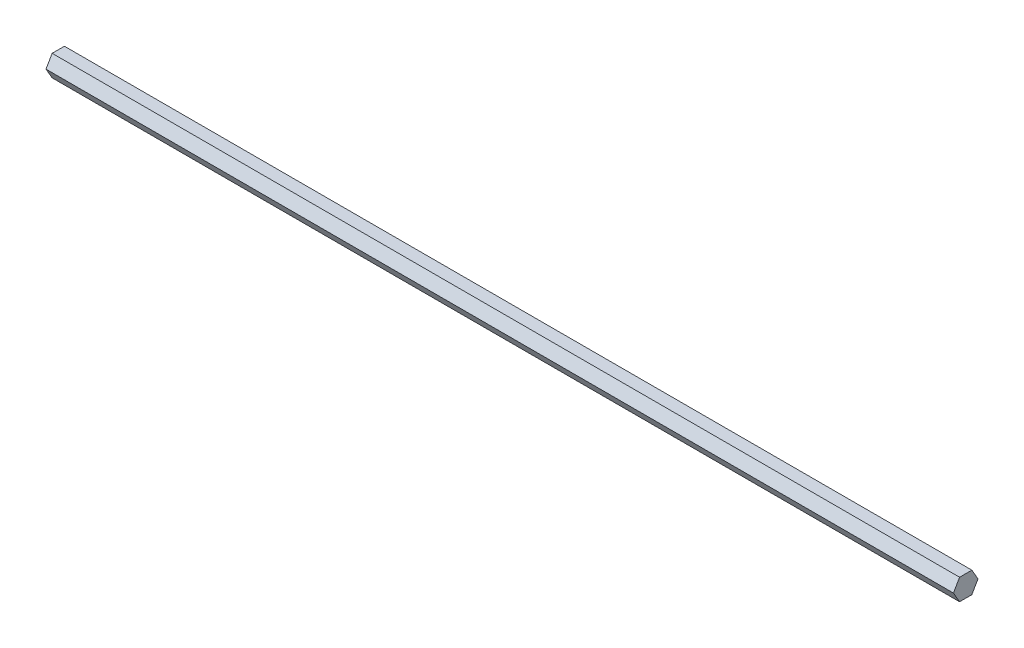
ISO-10303-21;
HEADER;
FILE_DESCRIPTION(('STEP AP214'),'2;1');
FILE_NAME('part.step','',(''),(''),'','','');
FILE_SCHEMA(('AUTOMOTIVE_DESIGN { 1 0 10303 214 1 1 1 1 }'));
ENDSEC;
DATA;
#1=APPLICATION_CONTEXT('core data for automotive mechanical design processes');
#2=APPLICATION_PROTOCOL_DEFINITION('international standard','automotive_design',2000,#1);
#3=PRODUCT_CONTEXT('',#1,'mechanical');
#4=PRODUCT('Part','Part','',(#3));
#5=PRODUCT_RELATED_PRODUCT_CATEGORY('part','',(#4));
#6=PRODUCT_DEFINITION_FORMATION('','',#4);
#7=PRODUCT_DEFINITION_CONTEXT('part definition',#1,'design');
#8=PRODUCT_DEFINITION('design','',#6,#7);
#9=PRODUCT_DEFINITION_SHAPE('','',#8);
#10=(LENGTH_UNIT() NAMED_UNIT(*) SI_UNIT(.MILLI.,.METRE.));
#11=(NAMED_UNIT(*) PLANE_ANGLE_UNIT() SI_UNIT($,.RADIAN.));
#12=(NAMED_UNIT(*) SI_UNIT($,.STERADIAN.) SOLID_ANGLE_UNIT());
#13=UNCERTAINTY_MEASURE_WITH_UNIT(LENGTH_MEASURE(1.E-05),#10,'distance_accuracy_value','');
#14=(GEOMETRIC_REPRESENTATION_CONTEXT(3) GLOBAL_UNCERTAINTY_ASSIGNED_CONTEXT((#13)) GLOBAL_UNIT_ASSIGNED_CONTEXT((#10,
#11,#12)) REPRESENTATION_CONTEXT('',''));
#15=CARTESIAN_POINT('',(0.,0.,0.));
#16=DIRECTION('',(0.,0.,1.));
#17=DIRECTION('',(1.,0.,0.));
#18=AXIS2_PLACEMENT_3D('',#15,#16,#17);
#19=CARTESIAN_POINT('',(203.2,-4.76249999999997,-2.74963065701565));
#20=DIRECTION('',(0.,0.499999999999995,0.866025403784441));
#21=DIRECTION('',(0.,-0.866025403784441,0.499999999999995));
#22=AXIS2_PLACEMENT_3D('',#19,#20,#21);
#23=PLANE('',#22);
#24=DIRECTION('',(0.,0.866025403784441,-0.499999999999995));
#25=VECTOR('',#24,1.);
#26=CARTESIAN_POINT('',(-203.2,-4.76249999999997,-2.74963065701565));
#27=LINE('',#26,#25);
#28=CARTESIAN_POINT('',(-203.2,-4.76249999999997,-2.74963065701565));
#29=VERTEX_POINT('',#28);
#30=CARTESIAN_POINT('',(-203.2,0.,-5.49926131403119));
#31=VERTEX_POINT('',#30);
#32=EDGE_CURVE('E132',#29,#31,#27,.T.);
#33=ORIENTED_EDGE('',*,*,#32,.T.);
#34=DIRECTION('',(-1.,0.,0.));
#35=VECTOR('',#34,1.);
#36=CARTESIAN_POINT('',(203.2,0.,-5.49926131403119));
#37=LINE('',#36,#35);
#38=CARTESIAN_POINT('',(203.2,0.,-5.49926131403119));
#39=VERTEX_POINT('',#38);
#40=EDGE_CURVE('E11',#39,#31,#37,.T.);
#41=ORIENTED_EDGE('',*,*,#40,.F.);
#42=DIRECTION('',(0.,0.866025403784441,-0.499999999999995));
#43=VECTOR('',#42,1.);
#44=CARTESIAN_POINT('',(203.2,-4.76249999999997,-2.74963065701565));
#45=LINE('',#44,#43);
#46=CARTESIAN_POINT('',(203.2,-4.76249999999997,-2.74963065701565));
#47=VERTEX_POINT('',#46);
#48=EDGE_CURVE('E143',#47,#39,#45,.T.);
#49=ORIENTED_EDGE('',*,*,#48,.F.);
#50=DIRECTION('',(-1.,0.,0.));
#51=VECTOR('',#50,1.);
#52=CARTESIAN_POINT('',(203.2,-4.76249999999997,-2.74963065701565));
#53=LINE('',#52,#51);
#54=EDGE_CURVE('E128',#47,#29,#53,.T.);
#55=ORIENTED_EDGE('',*,*,#54,.T.);
#56=EDGE_LOOP('',(#33,#41,#49,#55));
#57=FACE_BOUND('',#56,.T.);
#58=ADVANCED_FACE('F46',(#57),#23,.F.);
#59=CARTESIAN_POINT('',(203.2,0.,-5.49926131403119));
#60=DIRECTION('',(0.,-0.500000000000001,0.866025403784438));
#61=DIRECTION('',(0.,-0.866025403784438,-0.500000000000001));
#62=AXIS2_PLACEMENT_3D('',#59,#60,#61);
#63=PLANE('',#62);
#64=DIRECTION('',(0.,0.866025403784438,0.500000000000001));
#65=VECTOR('',#64,1.);
#66=CARTESIAN_POINT('',(-203.2,0.,-5.49926131403119));
#67=LINE('',#66,#65);
#68=CARTESIAN_POINT('',(-203.2,4.76250000000001,-2.74963065701558));
#69=VERTEX_POINT('',#68);
#70=EDGE_CURVE('E135',#31,#69,#67,.T.);
#71=ORIENTED_EDGE('',*,*,#70,.T.);
#72=DIRECTION('',(-1.,0.,0.));
#73=VECTOR('',#72,1.);
#74=CARTESIAN_POINT('',(203.2,4.76250000000001,-2.74963065701558));
#75=LINE('',#74,#73);
#76=CARTESIAN_POINT('',(203.2,4.76250000000001,-2.74963065701558));
#77=VERTEX_POINT('',#76);
#78=EDGE_CURVE('E54',#77,#69,#75,.T.);
#79=ORIENTED_EDGE('',*,*,#78,.F.);
#80=DIRECTION('',(0.,0.866025403784438,0.500000000000001));
#81=VECTOR('',#80,1.);
#82=CARTESIAN_POINT('',(203.2,0.,-5.49926131403119));
#83=LINE('',#82,#81);
#84=EDGE_CURVE('E100',#39,#77,#83,.T.);
#85=ORIENTED_EDGE('',*,*,#84,.F.);
#86=ORIENTED_EDGE('',*,*,#40,.T.);
#87=EDGE_LOOP('',(#71,#79,#85,#86));
#88=FACE_BOUND('',#87,.T.);
#89=ADVANCED_FACE('F167',(#88),#63,.F.);
#90=CARTESIAN_POINT('',(203.2,4.76250000000001,-2.74963065701558));
#91=DIRECTION('',(0.,-1.,0.));
#92=DIRECTION('',(0.,0.,-1.));
#93=AXIS2_PLACEMENT_3D('',#90,#91,#92);
#94=PLANE('',#93);
#95=DIRECTION('',(0.,0.,1.));
#96=VECTOR('',#95,1.);
#97=CARTESIAN_POINT('',(-203.2,4.76250000000001,-2.74963065701558));
#98=LINE('',#97,#96);
#99=CARTESIAN_POINT('',(-203.2,4.76249999999999,2.74963065701562));
#100=VERTEX_POINT('',#99);
#101=EDGE_CURVE('E138',#69,#100,#98,.T.);
#102=ORIENTED_EDGE('',*,*,#101,.T.);
#103=DIRECTION('',(-1.,0.,0.));
#104=VECTOR('',#103,1.);
#105=CARTESIAN_POINT('',(203.2,4.76249999999999,2.74963065701562));
#106=LINE('',#105,#104);
#107=CARTESIAN_POINT('',(203.2,4.76249999999999,2.74963065701562));
#108=VERTEX_POINT('',#107);
#109=EDGE_CURVE('E123',#108,#100,#106,.T.);
#110=ORIENTED_EDGE('',*,*,#109,.F.);
#111=DIRECTION('',(0.,0.,1.));
#112=VECTOR('',#111,1.);
#113=CARTESIAN_POINT('',(203.2,4.76250000000001,-2.74963065701558));
#114=LINE('',#113,#112);
#115=EDGE_CURVE('E114',#77,#108,#114,.T.);
#116=ORIENTED_EDGE('',*,*,#115,.F.);
#117=ORIENTED_EDGE('',*,*,#78,.T.);
#118=EDGE_LOOP('',(#102,#110,#116,#117));
#119=FACE_BOUND('',#118,.T.);
#120=ADVANCED_FACE('F149',(#119),#94,.F.);
#121=CARTESIAN_POINT('',(203.2,4.76249999999999,2.74963065701562));
#122=DIRECTION('',(0.,-0.499999999999995,-0.866025403784441));
#123=DIRECTION('',(0.,0.866025403784442,-0.499999999999995));
#124=AXIS2_PLACEMENT_3D('',#121,#122,#123);
#125=PLANE('',#124);
#126=DIRECTION('',(0.,-0.866025403784442,0.499999999999995));
#127=VECTOR('',#126,1.);
#128=CARTESIAN_POINT('',(-203.2,4.76249999999999,2.74963065701562));
#129=LINE('',#128,#127);
#130=CARTESIAN_POINT('',(-203.2,0.,5.49926131403119));
#131=VERTEX_POINT('',#130);
#132=EDGE_CURVE('E122',#100,#131,#129,.T.);
#133=ORIENTED_EDGE('',*,*,#132,.T.);
#134=DIRECTION('',(-1.,0.,0.));
#135=VECTOR('',#134,1.);
#136=CARTESIAN_POINT('',(203.2,0.,5.49926131403119));
#137=LINE('',#136,#135);
#138=CARTESIAN_POINT('',(203.2,0.,5.49926131403119));
#139=VERTEX_POINT('',#138);
#140=EDGE_CURVE('E119',#139,#131,#137,.T.);
#141=ORIENTED_EDGE('',*,*,#140,.F.);
#142=DIRECTION('',(0.,-0.866025403784442,0.499999999999995));
#143=VECTOR('',#142,1.);
#144=CARTESIAN_POINT('',(203.2,4.76249999999999,2.74963065701562));
#145=LINE('',#144,#143);
#146=EDGE_CURVE('E108',#108,#139,#145,.T.);
#147=ORIENTED_EDGE('',*,*,#146,.F.);
#148=ORIENTED_EDGE('',*,*,#109,.T.);
#149=EDGE_LOOP('',(#133,#141,#147,#148));
#150=FACE_BOUND('',#149,.T.);
#151=ADVANCED_FACE('F120',(#150),#125,.F.);
#152=CARTESIAN_POINT('',(203.2,0.,5.49926131403119));
#153=DIRECTION('',(0.,0.500000000000007,-0.866025403784435));
#154=DIRECTION('',(0.,0.866025403784435,0.500000000000007));
#155=AXIS2_PLACEMENT_3D('',#152,#153,#154);
#156=PLANE('',#155);
#157=DIRECTION('',(0.,-0.866025403784435,-0.500000000000007));
#158=VECTOR('',#157,1.);
#159=CARTESIAN_POINT('',(-203.2,0.,5.49926131403119));
#160=LINE('',#159,#158);
#161=CARTESIAN_POINT('',(-203.2,-4.76250000000003,2.74963065701555));
#162=VERTEX_POINT('',#161);
#163=EDGE_CURVE('E86',#131,#162,#160,.T.);
#164=ORIENTED_EDGE('',*,*,#163,.T.);
#165=DIRECTION('',(-1.,0.,0.));
#166=VECTOR('',#165,1.);
#167=CARTESIAN_POINT('',(203.2,-4.76250000000003,2.74963065701555));
#168=LINE('',#167,#166);
#169=CARTESIAN_POINT('',(203.2,-4.76250000000003,2.74963065701555));
#170=VERTEX_POINT('',#169);
#171=EDGE_CURVE('E124',#170,#162,#168,.T.);
#172=ORIENTED_EDGE('',*,*,#171,.F.);
#173=DIRECTION('',(0.,-0.866025403784435,-0.500000000000007));
#174=VECTOR('',#173,1.);
#175=CARTESIAN_POINT('',(203.2,0.,5.49926131403119));
#176=LINE('',#175,#174);
#177=EDGE_CURVE('E112',#139,#170,#176,.T.);
#178=ORIENTED_EDGE('',*,*,#177,.F.);
#179=ORIENTED_EDGE('',*,*,#140,.T.);
#180=EDGE_LOOP('',(#164,#172,#178,#179));
#181=FACE_BOUND('',#180,.T.);
#182=ADVANCED_FACE('F126',(#181),#156,.F.);
#183=CARTESIAN_POINT('',(203.2,-4.76250000000003,2.74963065701555));
#184=DIRECTION('',(0.,1.,0.));
#185=DIRECTION('',(0.,0.,1.));
#186=AXIS2_PLACEMENT_3D('',#183,#184,#185);
#187=PLANE('',#186);
#188=DIRECTION('',(0.,0.,-1.));
#189=VECTOR('',#188,1.);
#190=CARTESIAN_POINT('',(-203.2,-4.76250000000003,2.74963065701555));
#191=LINE('',#190,#189);
#192=EDGE_CURVE('E92',#162,#29,#191,.T.);
#193=ORIENTED_EDGE('',*,*,#192,.T.);
#194=ORIENTED_EDGE('',*,*,#54,.F.);
#195=DIRECTION('',(0.,0.,-1.));
#196=VECTOR('',#195,1.);
#197=CARTESIAN_POINT('',(203.2,-4.76250000000003,2.74963065701555));
#198=LINE('',#197,#196);
#199=EDGE_CURVE('E62',#170,#47,#198,.T.);
#200=ORIENTED_EDGE('',*,*,#199,.F.);
#201=ORIENTED_EDGE('',*,*,#171,.T.);
#202=EDGE_LOOP('',(#193,#194,#200,#201));
#203=FACE_BOUND('',#202,.T.);
#204=ADVANCED_FACE('F156',(#203),#187,.F.);
#205=CARTESIAN_POINT('',(203.2,0.,0.));
#206=DIRECTION('',(1.,0.,0.));
#207=DIRECTION('',(0.,0.,-1.));
#208=AXIS2_PLACEMENT_3D('',#205,#206,#207);
#209=PLANE('',#208);
#210=ORIENTED_EDGE('',*,*,#48,.T.);
#211=ORIENTED_EDGE('',*,*,#84,.T.);
#212=ORIENTED_EDGE('',*,*,#115,.T.);
#213=ORIENTED_EDGE('',*,*,#146,.T.);
#214=ORIENTED_EDGE('',*,*,#177,.T.);
#215=ORIENTED_EDGE('',*,*,#199,.T.);
#216=EDGE_LOOP('',(#210,#211,#212,#213,#214,#215));
#217=FACE_BOUND('',#216,.T.);
#218=ADVANCED_FACE('F110',(#217),#209,.T.);
#219=CARTESIAN_POINT('',(-203.2,0.,0.));
#220=DIRECTION('',(1.,0.,0.));
#221=DIRECTION('',(0.,0.,-1.));
#222=AXIS2_PLACEMENT_3D('',#219,#220,#221);
#223=PLANE('',#222);
#224=CARTESIAN_POINT('',(-203.2,0.,0.));
#225=DIRECTION('',(-1.,0.,0.));
#226=DIRECTION('',(0.,0.,1.));
#227=AXIS2_PLACEMENT_3D('',#224,#225,#226);
#228=CIRCLE('',#227,2.5527);
#229=CARTESIAN_POINT('',(-203.2,0.,2.5527));
#230=VERTEX_POINT('',#229);
#231=EDGE_CURVE('E276',#230,#230,#228,.T.);
#232=ORIENTED_EDGE('',*,*,#231,.F.);
#233=EDGE_LOOP('',(#232));
#234=FACE_BOUND('',#233,.T.);
#235=ORIENTED_EDGE('',*,*,#32,.F.);
#236=ORIENTED_EDGE('',*,*,#192,.F.);
#237=ORIENTED_EDGE('',*,*,#163,.F.);
#238=ORIENTED_EDGE('',*,*,#132,.F.);
#239=ORIENTED_EDGE('',*,*,#101,.F.);
#240=ORIENTED_EDGE('',*,*,#70,.F.);
#241=EDGE_LOOP('',(#235,#236,#237,#238,#239,#240));
#242=FACE_BOUND('',#241,.T.);
#243=ADVANCED_FACE('F152',(#234,#242),#223,.F.);
#244=CARTESIAN_POINT('',(-184.15,0.,0.));
#245=DIRECTION('',(-1.,0.,0.));
#246=DIRECTION('',(0.,0.,1.));
#247=AXIS2_PLACEMENT_3D('',#244,#245,#246);
#248=CONICAL_SURFACE('',#247,2.5527,1.02974425867665);
#249=CARTESIAN_POINT('',(-182.616183097808,0.,0.));
#250=VERTEX_POINT('',#249);
#251=VERTEX_LOOP('',#250);
#252=FACE_BOUND('',#251,.T.);
#253=CARTESIAN_POINT('',(-184.15,0.,0.));
#254=DIRECTION('',(-1.,0.,0.));
#255=DIRECTION('',(0.,0.,1.));
#256=AXIS2_PLACEMENT_3D('',#253,#254,#255);
#257=CIRCLE('',#256,2.5527);
#258=CARTESIAN_POINT('',(-184.15,0.,2.5527));
#259=VERTEX_POINT('',#258);
#260=EDGE_CURVE('E136',#259,#259,#257,.T.);
#261=ORIENTED_EDGE('',*,*,#260,.T.);
#262=EDGE_LOOP('',(#261));
#263=FACE_BOUND('',#262,.T.);
#264=ADVANCED_FACE('F211',(#252,#263),#248,.F.);
#265=CARTESIAN_POINT('',(-203.2,0.,0.));
#266=DIRECTION('',(-1.,0.,0.));
#267=DIRECTION('',(0.,0.,1.));
#268=AXIS2_PLACEMENT_3D('',#265,#266,#267);
#269=CYLINDRICAL_SURFACE('',#268,2.5527);
#270=ORIENTED_EDGE('',*,*,#260,.F.);
#271=EDGE_LOOP('',(#270));
#272=FACE_BOUND('',#271,.T.);
#273=ORIENTED_EDGE('',*,*,#231,.T.);
#274=EDGE_LOOP('',(#273));
#275=FACE_BOUND('',#274,.T.);
#276=ADVANCED_FACE('F220',(#272,#275),#269,.F.);
#277=CLOSED_SHELL('',(#58,#89,#120,#151,#182,#204,#218,#243,#264,#276));
#278=MANIFOLD_SOLID_BREP('B2',#277);
#279=ADVANCED_BREP_SHAPE_REPRESENTATION('',(#18,#278),#14);
#280=SHAPE_DEFINITION_REPRESENTATION(#9,#279);
ENDSEC;
END-ISO-10303-21;
